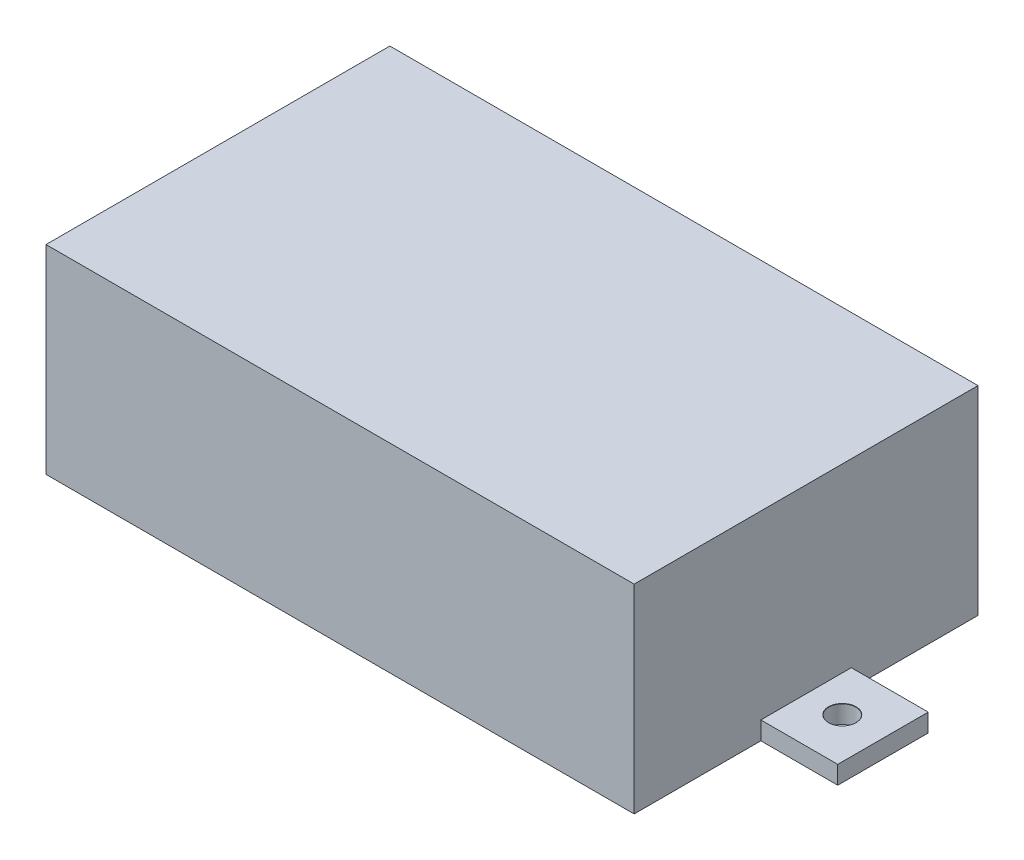
ISO-10303-21;
HEADER;
FILE_DESCRIPTION(('STEP AP214'),'2;1');
FILE_NAME('part.step','',(''),(''),'','','');
FILE_SCHEMA(('AUTOMOTIVE_DESIGN { 1 0 10303 214 1 1 1 1 }'));
ENDSEC;
DATA;
#1=APPLICATION_CONTEXT('core data for automotive mechanical design processes');
#2=APPLICATION_PROTOCOL_DEFINITION('international standard','automotive_design',2000,#1);
#3=PRODUCT_CONTEXT('',#1,'mechanical');
#4=PRODUCT('Part','Part','',(#3));
#5=PRODUCT_RELATED_PRODUCT_CATEGORY('part','',(#4));
#6=PRODUCT_DEFINITION_FORMATION('','',#4);
#7=PRODUCT_DEFINITION_CONTEXT('part definition',#1,'design');
#8=PRODUCT_DEFINITION('design','',#6,#7);
#9=PRODUCT_DEFINITION_SHAPE('','',#8);
#10=(LENGTH_UNIT() NAMED_UNIT(*) SI_UNIT(.MILLI.,.METRE.));
#11=(NAMED_UNIT(*) PLANE_ANGLE_UNIT() SI_UNIT($,.RADIAN.));
#12=(NAMED_UNIT(*) SI_UNIT($,.STERADIAN.) SOLID_ANGLE_UNIT());
#13=UNCERTAINTY_MEASURE_WITH_UNIT(LENGTH_MEASURE(1.E-05),#10,'distance_accuracy_value','');
#14=(GEOMETRIC_REPRESENTATION_CONTEXT(3) GLOBAL_UNCERTAINTY_ASSIGNED_CONTEXT((#13)) GLOBAL_UNIT_ASSIGNED_CONTEXT((#10,
#11,#12)) REPRESENTATION_CONTEXT('',''));
#15=CARTESIAN_POINT('',(0.,0.,0.));
#16=DIRECTION('',(0.,0.,1.));
#17=DIRECTION('',(1.,0.,0.));
#18=AXIS2_PLACEMENT_3D('',#15,#16,#17);
#19=CARTESIAN_POINT('',(32.5,22.,-19.));
#20=DIRECTION('',(-1.,0.,0.));
#21=DIRECTION('',(0.,0.,1.));
#22=AXIS2_PLACEMENT_3D('',#19,#20,#21);
#23=PLANE('',#22);
#24=DIRECTION('',(0.,0.,1.));
#25=VECTOR('',#24,1.);
#26=CARTESIAN_POINT('',(32.5,2.,-19.));
#27=LINE('',#26,#25);
#28=CARTESIAN_POINT('',(32.5,2.,-5.));
#29=VERTEX_POINT('',#28);
#30=CARTESIAN_POINT('',(32.5,2.,5.));
#31=VERTEX_POINT('',#30);
#32=EDGE_CURVE('E55',#29,#31,#27,.T.);
#33=ORIENTED_EDGE('',*,*,#32,.F.);
#34=DIRECTION('',(0.,-1.,0.));
#35=VECTOR('',#34,1.);
#36=CARTESIAN_POINT('',(32.5,22.,-5.));
#37=LINE('',#36,#35);
#38=CARTESIAN_POINT('',(32.5,0.,-5.));
#39=VERTEX_POINT('',#38);
#40=EDGE_CURVE('E181',#29,#39,#37,.T.);
#41=ORIENTED_EDGE('',*,*,#40,.T.);
#42=DIRECTION('',(0.,0.,-1.));
#43=VECTOR('',#42,1.);
#44=CARTESIAN_POINT('',(32.5,0.,-19.));
#45=LINE('',#44,#43);
#46=CARTESIAN_POINT('',(32.5,0.,-19.));
#47=VERTEX_POINT('',#46);
#48=EDGE_CURVE('E184',#39,#47,#45,.T.);
#49=ORIENTED_EDGE('',*,*,#48,.T.);
#50=DIRECTION('',(0.,-1.,0.));
#51=VECTOR('',#50,1.);
#52=CARTESIAN_POINT('',(32.5,22.,-19.));
#53=LINE('',#52,#51);
#54=CARTESIAN_POINT('',(32.5,22.,-19.));
#55=VERTEX_POINT('',#54);
#56=EDGE_CURVE('E44',#55,#47,#53,.T.);
#57=ORIENTED_EDGE('',*,*,#56,.F.);
#58=DIRECTION('',(0.,0.,-1.));
#59=VECTOR('',#58,1.);
#60=CARTESIAN_POINT('',(32.5,22.,-19.));
#61=LINE('',#60,#59);
#62=CARTESIAN_POINT('',(32.5,22.,19.));
#63=VERTEX_POINT('',#62);
#64=EDGE_CURVE('E185',#63,#55,#61,.T.);
#65=ORIENTED_EDGE('',*,*,#64,.F.);
#66=DIRECTION('',(0.,-1.,0.));
#67=VECTOR('',#66,1.);
#68=CARTESIAN_POINT('',(32.5,22.,19.));
#69=LINE('',#68,#67);
#70=CARTESIAN_POINT('',(32.5,0.,19.));
#71=VERTEX_POINT('',#70);
#72=EDGE_CURVE('E195',#63,#71,#69,.T.);
#73=ORIENTED_EDGE('',*,*,#72,.T.);
#74=CARTESIAN_POINT('',(32.5,0.,5.));
#75=VERTEX_POINT('',#74);
#76=EDGE_CURVE('E196',#71,#75,#45,.T.);
#77=ORIENTED_EDGE('',*,*,#76,.T.);
#78=DIRECTION('',(0.,1.,0.));
#79=VECTOR('',#78,1.);
#80=CARTESIAN_POINT('',(32.5,22.,5.));
#81=LINE('',#80,#79);
#82=EDGE_CURVE('E51',#75,#31,#81,.T.);
#83=ORIENTED_EDGE('',*,*,#82,.T.);
#84=EDGE_LOOP('',(#33,#41,#49,#57,#65,#73,#77,#83));
#85=FACE_BOUND('',#84,.T.);
#86=ADVANCED_FACE('F37',(#85),#23,.F.);
#87=CARTESIAN_POINT('',(-32.5,22.,-19.));
#88=DIRECTION('',(0.,0.,1.));
#89=DIRECTION('',(1.,0.,0.));
#90=AXIS2_PLACEMENT_3D('',#87,#88,#89);
#91=PLANE('',#90);
#92=DIRECTION('',(-1.,0.,0.));
#93=VECTOR('',#92,1.);
#94=CARTESIAN_POINT('',(-32.5,0.,-19.));
#95=LINE('',#94,#93);
#96=CARTESIAN_POINT('',(-32.5,0.,-19.));
#97=VERTEX_POINT('',#96);
#98=EDGE_CURVE('E198',#47,#97,#95,.T.);
#99=ORIENTED_EDGE('',*,*,#98,.T.);
#100=DIRECTION('',(0.,-1.,0.));
#101=VECTOR('',#100,1.);
#102=CARTESIAN_POINT('',(-32.5,22.,-19.));
#103=LINE('',#102,#101);
#104=CARTESIAN_POINT('',(-32.5,22.,-19.));
#105=VERTEX_POINT('',#104);
#106=EDGE_CURVE('E209',#105,#97,#103,.T.);
#107=ORIENTED_EDGE('',*,*,#106,.F.);
#108=DIRECTION('',(-1.,0.,0.));
#109=VECTOR('',#108,1.);
#110=CARTESIAN_POINT('',(-32.5,22.,-19.));
#111=LINE('',#110,#109);
#112=EDGE_CURVE('E188',#55,#105,#111,.T.);
#113=ORIENTED_EDGE('',*,*,#112,.F.);
#114=ORIENTED_EDGE('',*,*,#56,.T.);
#115=EDGE_LOOP('',(#99,#107,#113,#114));
#116=FACE_BOUND('',#115,.T.);
#117=ADVANCED_FACE('F214',(#116),#91,.F.);
#118=CARTESIAN_POINT('',(-32.5,22.,-19.));
#119=DIRECTION('',(1.,0.,0.));
#120=DIRECTION('',(0.,0.,-1.));
#121=AXIS2_PLACEMENT_3D('',#118,#119,#120);
#122=PLANE('',#121);
#123=DIRECTION('',(0.,0.,1.));
#124=VECTOR('',#123,1.);
#125=CARTESIAN_POINT('',(-32.5,0.,-19.));
#126=LINE('',#125,#124);
#127=CARTESIAN_POINT('',(-32.5,0.,-5.));
#128=VERTEX_POINT('',#127);
#129=EDGE_CURVE('E201',#97,#128,#126,.T.);
#130=ORIENTED_EDGE('',*,*,#129,.T.);
#131=DIRECTION('',(0.,1.,0.));
#132=VECTOR('',#131,1.);
#133=CARTESIAN_POINT('',(-32.5,22.,-5.));
#134=LINE('',#133,#132);
#135=CARTESIAN_POINT('',(-32.5,2.,-5.));
#136=VERTEX_POINT('',#135);
#137=EDGE_CURVE('E179',#128,#136,#134,.T.);
#138=ORIENTED_EDGE('',*,*,#137,.T.);
#139=DIRECTION('',(0.,0.,-1.));
#140=VECTOR('',#139,1.);
#141=CARTESIAN_POINT('',(-32.5,2.,-19.));
#142=LINE('',#141,#140);
#143=CARTESIAN_POINT('',(-32.5,2.,5.));
#144=VERTEX_POINT('',#143);
#145=EDGE_CURVE('E11',#144,#136,#142,.T.);
#146=ORIENTED_EDGE('',*,*,#145,.F.);
#147=DIRECTION('',(0.,-1.,0.));
#148=VECTOR('',#147,1.);
#149=CARTESIAN_POINT('',(-32.5,22.,5.));
#150=LINE('',#149,#148);
#151=CARTESIAN_POINT('',(-32.5,0.,5.));
#152=VERTEX_POINT('',#151);
#153=EDGE_CURVE('E171',#144,#152,#150,.T.);
#154=ORIENTED_EDGE('',*,*,#153,.T.);
#155=CARTESIAN_POINT('',(-32.5,0.,19.));
#156=VERTEX_POINT('',#155);
#157=EDGE_CURVE('E200',#152,#156,#126,.T.);
#158=ORIENTED_EDGE('',*,*,#157,.T.);
#159=DIRECTION('',(0.,-1.,0.));
#160=VECTOR('',#159,1.);
#161=CARTESIAN_POINT('',(-32.5,22.,19.));
#162=LINE('',#161,#160);
#163=CARTESIAN_POINT('',(-32.5,22.,19.));
#164=VERTEX_POINT('',#163);
#165=EDGE_CURVE('E206',#164,#156,#162,.T.);
#166=ORIENTED_EDGE('',*,*,#165,.F.);
#167=DIRECTION('',(0.,0.,1.));
#168=VECTOR('',#167,1.);
#169=CARTESIAN_POINT('',(-32.5,22.,-19.));
#170=LINE('',#169,#168);
#171=EDGE_CURVE('E191',#105,#164,#170,.T.);
#172=ORIENTED_EDGE('',*,*,#171,.F.);
#173=ORIENTED_EDGE('',*,*,#106,.T.);
#174=EDGE_LOOP('',(#130,#138,#146,#154,#158,#166,#172,#173));
#175=FACE_BOUND('',#174,.T.);
#176=ADVANCED_FACE('F225',(#175),#122,.F.);
#177=CARTESIAN_POINT('',(-32.5,22.,19.));
#178=DIRECTION('',(0.,0.,-1.));
#179=DIRECTION('',(-1.,0.,0.));
#180=AXIS2_PLACEMENT_3D('',#177,#178,#179);
#181=PLANE('',#180);
#182=DIRECTION('',(1.,0.,0.));
#183=VECTOR('',#182,1.);
#184=CARTESIAN_POINT('',(-32.5,0.,19.));
#185=LINE('',#184,#183);
#186=EDGE_CURVE('E189',#156,#71,#185,.T.);
#187=ORIENTED_EDGE('',*,*,#186,.T.);
#188=ORIENTED_EDGE('',*,*,#72,.F.);
#189=DIRECTION('',(1.,0.,0.));
#190=VECTOR('',#189,1.);
#191=CARTESIAN_POINT('',(-32.5,22.,19.));
#192=LINE('',#191,#190);
#193=EDGE_CURVE('E193',#164,#63,#192,.T.);
#194=ORIENTED_EDGE('',*,*,#193,.F.);
#195=ORIENTED_EDGE('',*,*,#165,.T.);
#196=EDGE_LOOP('',(#187,#188,#194,#195));
#197=FACE_BOUND('',#196,.T.);
#198=ADVANCED_FACE('F245',(#197),#181,.F.);
#199=CARTESIAN_POINT('',(0.,22.,0.));
#200=DIRECTION('',(0.,1.,0.));
#201=DIRECTION('',(0.,0.,1.));
#202=AXIS2_PLACEMENT_3D('',#199,#200,#201);
#203=PLANE('',#202);
#204=ORIENTED_EDGE('',*,*,#64,.T.);
#205=ORIENTED_EDGE('',*,*,#112,.T.);
#206=ORIENTED_EDGE('',*,*,#171,.T.);
#207=ORIENTED_EDGE('',*,*,#193,.T.);
#208=EDGE_LOOP('',(#204,#205,#206,#207));
#209=FACE_BOUND('',#208,.T.);
#210=ADVANCED_FACE('F248',(#209),#203,.T.);
#211=CARTESIAN_POINT('',(0.,0.,0.));
#212=DIRECTION('',(0.,1.,0.));
#213=DIRECTION('',(0.,0.,1.));
#214=AXIS2_PLACEMENT_3D('',#211,#212,#213);
#215=PLANE('',#214);
#216=CARTESIAN_POINT('',(-36.5,0.,0.));
#217=DIRECTION('',(0.,1.,0.));
#218=DIRECTION('',(0.,0.,1.));
#219=AXIS2_PLACEMENT_3D('',#216,#217,#218);
#220=CIRCLE('',#219,1.5);
#221=CARTESIAN_POINT('',(-36.5,0.,1.5));
#222=VERTEX_POINT('',#221);
#223=EDGE_CURVE('E414',#222,#222,#220,.T.);
#224=ORIENTED_EDGE('',*,*,#223,.T.);
#225=EDGE_LOOP('',(#224));
#226=FACE_BOUND('',#225,.T.);
#227=CARTESIAN_POINT('',(36.5,0.,0.));
#228=DIRECTION('',(0.,1.,0.));
#229=DIRECTION('',(0.,0.,1.));
#230=AXIS2_PLACEMENT_3D('',#227,#228,#229);
#231=CIRCLE('',#230,1.5);
#232=CARTESIAN_POINT('',(36.5,0.,1.5));
#233=VERTEX_POINT('',#232);
#234=EDGE_CURVE('E155',#233,#233,#231,.T.);
#235=ORIENTED_EDGE('',*,*,#234,.T.);
#236=EDGE_LOOP('',(#235));
#237=FACE_BOUND('',#236,.T.);
#238=ORIENTED_EDGE('',*,*,#157,.F.);
#239=DIRECTION('',(-1.,0.,0.));
#240=VECTOR('',#239,1.);
#241=CARTESIAN_POINT('',(-41.,0.,5.));
#242=LINE('',#241,#240);
#243=CARTESIAN_POINT('',(-41.,0.,5.));
#244=VERTEX_POINT('',#243);
#245=EDGE_CURVE('E165',#152,#244,#242,.T.);
#246=ORIENTED_EDGE('',*,*,#245,.T.);
#247=DIRECTION('',(0.,0.,-1.));
#248=VECTOR('',#247,1.);
#249=CARTESIAN_POINT('',(-41.,0.,5.));
#250=LINE('',#249,#248);
#251=CARTESIAN_POINT('',(-41.,0.,-5.));
#252=VERTEX_POINT('',#251);
#253=EDGE_CURVE('E167',#244,#252,#250,.T.);
#254=ORIENTED_EDGE('',*,*,#253,.T.);
#255=DIRECTION('',(1.,0.,0.));
#256=VECTOR('',#255,1.);
#257=CARTESIAN_POINT('',(-41.,0.,-5.));
#258=LINE('',#257,#256);
#259=EDGE_CURVE('E149',#252,#128,#258,.T.);
#260=ORIENTED_EDGE('',*,*,#259,.T.);
#261=ORIENTED_EDGE('',*,*,#129,.F.);
#262=ORIENTED_EDGE('',*,*,#98,.F.);
#263=ORIENTED_EDGE('',*,*,#48,.F.);
#264=CARTESIAN_POINT('',(41.,0.,-5.));
#265=VERTEX_POINT('',#264);
#266=EDGE_CURVE('E152',#39,#265,#258,.T.);
#267=ORIENTED_EDGE('',*,*,#266,.T.);
#268=DIRECTION('',(0.,0.,1.));
#269=VECTOR('',#268,1.);
#270=CARTESIAN_POINT('',(41.,0.,5.));
#271=LINE('',#270,#269);
#272=CARTESIAN_POINT('',(41.,0.,5.));
#273=VERTEX_POINT('',#272);
#274=EDGE_CURVE('E163',#265,#273,#271,.T.);
#275=ORIENTED_EDGE('',*,*,#274,.T.);
#276=EDGE_CURVE('E129',#273,#75,#242,.T.);
#277=ORIENTED_EDGE('',*,*,#276,.T.);
#278=ORIENTED_EDGE('',*,*,#76,.F.);
#279=ORIENTED_EDGE('',*,*,#186,.F.);
#280=EDGE_LOOP('',(#238,#246,#254,#260,#261,#262,#263,#267,#275,#277,#278,#279));
#281=FACE_BOUND('',#280,.T.);
#282=ADVANCED_FACE('F221',(#226,#237,#281),#215,.F.);
#283=CARTESIAN_POINT('',(-41.,2.,5.));
#284=DIRECTION('',(-1.,0.,0.));
#285=DIRECTION('',(0.,0.,1.));
#286=AXIS2_PLACEMENT_3D('',#283,#284,#285);
#287=PLANE('',#286);
#288=ORIENTED_EDGE('',*,*,#253,.F.);
#289=DIRECTION('',(0.,-1.,0.));
#290=VECTOR('',#289,1.);
#291=CARTESIAN_POINT('',(-41.,2.,5.));
#292=LINE('',#291,#290);
#293=CARTESIAN_POINT('',(-41.,2.,5.));
#294=VERTEX_POINT('',#293);
#295=EDGE_CURVE('E134',#294,#244,#292,.T.);
#296=ORIENTED_EDGE('',*,*,#295,.F.);
#297=DIRECTION('',(0.,0.,-1.));
#298=VECTOR('',#297,1.);
#299=CARTESIAN_POINT('',(-41.,2.,5.));
#300=LINE('',#299,#298);
#301=CARTESIAN_POINT('',(-41.,2.,-5.));
#302=VERTEX_POINT('',#301);
#303=EDGE_CURVE('E142',#294,#302,#300,.T.);
#304=ORIENTED_EDGE('',*,*,#303,.T.);
#305=DIRECTION('',(0.,-1.,0.));
#306=VECTOR('',#305,1.);
#307=CARTESIAN_POINT('',(-41.,2.,-5.));
#308=LINE('',#307,#306);
#309=EDGE_CURVE('E172',#302,#252,#308,.T.);
#310=ORIENTED_EDGE('',*,*,#309,.T.);
#311=EDGE_LOOP('',(#288,#296,#304,#310));
#312=FACE_BOUND('',#311,.T.);
#313=ADVANCED_FACE('F255',(#312),#287,.T.);
#314=CARTESIAN_POINT('',(0.,2.,0.));
#315=DIRECTION('',(0.,-1.,0.));
#316=DIRECTION('',(0.,0.,-1.));
#317=AXIS2_PLACEMENT_3D('',#314,#315,#316);
#318=PLANE('',#317);
#319=CARTESIAN_POINT('',(-36.5,2.,0.));
#320=DIRECTION('',(0.,1.,0.));
#321=DIRECTION('',(0.,0.,1.));
#322=AXIS2_PLACEMENT_3D('',#319,#320,#321);
#323=CIRCLE('',#322,1.525);
#324=CARTESIAN_POINT('',(-36.5,2.,1.525));
#325=VERTEX_POINT('',#324);
#326=EDGE_CURVE('E412',#325,#325,#323,.T.);
#327=ORIENTED_EDGE('',*,*,#326,.F.);
#328=EDGE_LOOP('',(#327));
#329=FACE_BOUND('',#328,.T.);
#330=DIRECTION('',(-1.,0.,0.));
#331=VECTOR('',#330,1.);
#332=CARTESIAN_POINT('',(-41.,2.,5.));
#333=LINE('',#332,#331);
#334=EDGE_CURVE('E143',#144,#294,#333,.T.);
#335=ORIENTED_EDGE('',*,*,#334,.F.);
#336=ORIENTED_EDGE('',*,*,#145,.T.);
#337=DIRECTION('',(1.,0.,0.));
#338=VECTOR('',#337,1.);
#339=CARTESIAN_POINT('',(-41.,2.,-5.));
#340=LINE('',#339,#338);
#341=EDGE_CURVE('E135',#302,#136,#340,.T.);
#342=ORIENTED_EDGE('',*,*,#341,.F.);
#343=ORIENTED_EDGE('',*,*,#303,.F.);
#344=EDGE_LOOP('',(#335,#336,#342,#343));
#345=FACE_BOUND('',#344,.T.);
#346=ADVANCED_FACE('F233',(#329,#345),#318,.F.);
#347=CARTESIAN_POINT('',(-41.,2.,5.));
#348=DIRECTION('',(0.,0.,1.));
#349=DIRECTION('',(1.,0.,0.));
#350=AXIS2_PLACEMENT_3D('',#347,#348,#349);
#351=PLANE('',#350);
#352=ORIENTED_EDGE('',*,*,#153,.F.);
#353=ORIENTED_EDGE('',*,*,#334,.T.);
#354=ORIENTED_EDGE('',*,*,#295,.T.);
#355=ORIENTED_EDGE('',*,*,#245,.F.);
#356=EDGE_LOOP('',(#352,#353,#354,#355));
#357=FACE_BOUND('',#356,.T.);
#358=ADVANCED_FACE('F237',(#357),#351,.T.);
#359=CARTESIAN_POINT('',(-41.,2.,-5.));
#360=DIRECTION('',(0.,0.,-1.));
#361=DIRECTION('',(-1.,0.,0.));
#362=AXIS2_PLACEMENT_3D('',#359,#360,#361);
#363=PLANE('',#362);
#364=ORIENTED_EDGE('',*,*,#137,.F.);
#365=ORIENTED_EDGE('',*,*,#259,.F.);
#366=ORIENTED_EDGE('',*,*,#309,.F.);
#367=ORIENTED_EDGE('',*,*,#341,.T.);
#368=EDGE_LOOP('',(#364,#365,#366,#367));
#369=FACE_BOUND('',#368,.T.);
#370=ADVANCED_FACE('F228',(#369),#363,.T.);
#371=CARTESIAN_POINT('',(36.5,2.,0.));
#372=DIRECTION('',(0.,1.,0.));
#373=DIRECTION('',(0.,0.,1.));
#374=AXIS2_PLACEMENT_3D('',#371,#372,#373);
#375=CIRCLE('',#374,1.525);
#376=CARTESIAN_POINT('',(36.5,2.,1.525));
#377=VERTEX_POINT('',#376);
#378=EDGE_CURVE('E419',#377,#377,#375,.T.);
#379=ORIENTED_EDGE('',*,*,#378,.F.);
#380=EDGE_LOOP('',(#379));
#381=FACE_BOUND('',#380,.T.);
#382=CARTESIAN_POINT('',(41.,2.,-5.));
#383=VERTEX_POINT('',#382);
#384=EDGE_CURVE('E160',#29,#383,#340,.T.);
#385=ORIENTED_EDGE('',*,*,#384,.F.);
#386=ORIENTED_EDGE('',*,*,#32,.T.);
#387=CARTESIAN_POINT('',(41.,2.,5.));
#388=VERTEX_POINT('',#387);
#389=EDGE_CURVE('E127',#388,#31,#333,.T.);
#390=ORIENTED_EDGE('',*,*,#389,.F.);
#391=DIRECTION('',(0.,0.,1.));
#392=VECTOR('',#391,1.);
#393=CARTESIAN_POINT('',(41.,2.,5.));
#394=LINE('',#393,#392);
#395=EDGE_CURVE('E141',#383,#388,#394,.T.);
#396=ORIENTED_EDGE('',*,*,#395,.F.);
#397=EDGE_LOOP('',(#385,#386,#390,#396));
#398=FACE_BOUND('',#397,.T.);
#399=ADVANCED_FACE('F140',(#381,#398),#318,.F.);
#400=ORIENTED_EDGE('',*,*,#40,.F.);
#401=ORIENTED_EDGE('',*,*,#384,.T.);
#402=DIRECTION('',(0.,-1.,0.));
#403=VECTOR('',#402,1.);
#404=CARTESIAN_POINT('',(41.,2.,-5.));
#405=LINE('',#404,#403);
#406=EDGE_CURVE('E148',#383,#265,#405,.T.);
#407=ORIENTED_EDGE('',*,*,#406,.T.);
#408=ORIENTED_EDGE('',*,*,#266,.F.);
#409=EDGE_LOOP('',(#400,#401,#407,#408));
#410=FACE_BOUND('',#409,.T.);
#411=ADVANCED_FACE('F332',(#410),#363,.T.);
#412=ORIENTED_EDGE('',*,*,#82,.F.);
#413=ORIENTED_EDGE('',*,*,#276,.F.);
#414=DIRECTION('',(0.,-1.,0.));
#415=VECTOR('',#414,1.);
#416=CARTESIAN_POINT('',(41.,2.,5.));
#417=LINE('',#416,#415);
#418=EDGE_CURVE('E124',#388,#273,#417,.T.);
#419=ORIENTED_EDGE('',*,*,#418,.F.);
#420=ORIENTED_EDGE('',*,*,#389,.T.);
#421=EDGE_LOOP('',(#412,#413,#419,#420));
#422=FACE_BOUND('',#421,.T.);
#423=ADVANCED_FACE('F126',(#422),#351,.T.);
#424=CARTESIAN_POINT('',(41.,2.,5.));
#425=DIRECTION('',(1.,0.,0.));
#426=DIRECTION('',(0.,0.,-1.));
#427=AXIS2_PLACEMENT_3D('',#424,#425,#426);
#428=PLANE('',#427);
#429=ORIENTED_EDGE('',*,*,#274,.F.);
#430=ORIENTED_EDGE('',*,*,#406,.F.);
#431=ORIENTED_EDGE('',*,*,#395,.T.);
#432=ORIENTED_EDGE('',*,*,#418,.T.);
#433=EDGE_LOOP('',(#429,#430,#431,#432));
#434=FACE_BOUND('',#433,.T.);
#435=ADVANCED_FACE('F146',(#434),#428,.T.);
#436=CARTESIAN_POINT('',(36.5,2.,0.));
#437=DIRECTION('',(0.,1.,0.));
#438=DIRECTION('',(0.,0.,1.));
#439=AXIS2_PLACEMENT_3D('',#436,#437,#438);
#440=CYLINDRICAL_SURFACE('',#439,1.49999999999999);
#441=ORIENTED_EDGE('',*,*,#234,.F.);
#442=EDGE_LOOP('',(#441));
#443=FACE_BOUND('',#442,.T.);
#444=CARTESIAN_POINT('',(36.5,1.975,0.));
#445=DIRECTION('',(0.,1.,0.));
#446=DIRECTION('',(0.,0.,1.));
#447=AXIS2_PLACEMENT_3D('',#444,#445,#446);
#448=CIRCLE('',#447,1.49999999999999);
#449=CARTESIAN_POINT('',(36.5,1.975,1.49999999999999));
#450=VERTEX_POINT('',#449);
#451=EDGE_CURVE('E421',#450,#450,#448,.T.);
#452=ORIENTED_EDGE('',*,*,#451,.T.);
#453=EDGE_LOOP('',(#452));
#454=FACE_BOUND('',#453,.T.);
#455=ADVANCED_FACE('F358',(#443,#454),#440,.F.);
#456=CARTESIAN_POINT('',(36.5,2.,0.));
#457=DIRECTION('',(0.,1.,0.));
#458=DIRECTION('',(0.,0.,1.));
#459=AXIS2_PLACEMENT_3D('',#456,#457,#458);
#460=CONICAL_SURFACE('',#459,1.525,0.785398163397691);
#461=ORIENTED_EDGE('',*,*,#451,.F.);
#462=EDGE_LOOP('',(#461));
#463=FACE_BOUND('',#462,.T.);
#464=ORIENTED_EDGE('',*,*,#378,.T.);
#465=EDGE_LOOP('',(#464));
#466=FACE_BOUND('',#465,.T.);
#467=ADVANCED_FACE('F364',(#463,#466),#460,.F.);
#468=CARTESIAN_POINT('',(-36.5,2.,0.));
#469=DIRECTION('',(0.,1.,0.));
#470=DIRECTION('',(0.,0.,1.));
#471=AXIS2_PLACEMENT_3D('',#468,#469,#470);
#472=CYLINDRICAL_SURFACE('',#471,1.49999999999999);
#473=ORIENTED_EDGE('',*,*,#223,.F.);
#474=EDGE_LOOP('',(#473));
#475=FACE_BOUND('',#474,.T.);
#476=CARTESIAN_POINT('',(-36.5,1.975,0.));
#477=DIRECTION('',(0.,1.,0.));
#478=DIRECTION('',(0.,0.,1.));
#479=AXIS2_PLACEMENT_3D('',#476,#477,#478);
#480=CIRCLE('',#479,1.49999999999999);
#481=CARTESIAN_POINT('',(-36.5,1.975,1.49999999999999));
#482=VERTEX_POINT('',#481);
#483=EDGE_CURVE('E409',#482,#482,#480,.T.);
#484=ORIENTED_EDGE('',*,*,#483,.T.);
#485=EDGE_LOOP('',(#484));
#486=FACE_BOUND('',#485,.T.);
#487=ADVANCED_FACE('F373',(#475,#486),#472,.F.);
#488=CARTESIAN_POINT('',(-36.5,2.,0.));
#489=DIRECTION('',(0.,1.,0.));
#490=DIRECTION('',(0.,0.,1.));
#491=AXIS2_PLACEMENT_3D('',#488,#489,#490);
#492=CONICAL_SURFACE('',#491,1.525,0.785398163397691);
#493=ORIENTED_EDGE('',*,*,#483,.F.);
#494=EDGE_LOOP('',(#493));
#495=FACE_BOUND('',#494,.T.);
#496=ORIENTED_EDGE('',*,*,#326,.T.);
#497=EDGE_LOOP('',(#496));
#498=FACE_BOUND('',#497,.T.);
#499=ADVANCED_FACE('F382',(#495,#498),#492,.F.);
#500=CLOSED_SHELL('',(#86,#117,#176,#198,#210,#282,#313,#346,#358,#370,#399,#411,#423,#435,#455,
#467,#487,#499));
#501=MANIFOLD_SOLID_BREP('B2',#500);
#502=ADVANCED_BREP_SHAPE_REPRESENTATION('',(#18,#501),#14);
#503=SHAPE_DEFINITION_REPRESENTATION(#9,#502);
ENDSEC;
END-ISO-10303-21;
